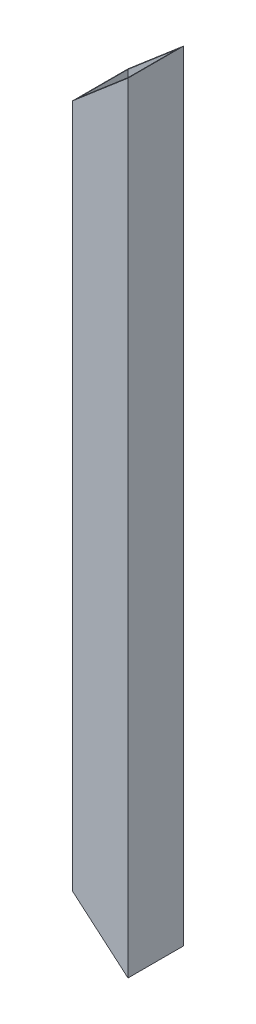
ISO-10303-21;
HEADER;
FILE_DESCRIPTION(('STEP AP214'),'2;1');
FILE_NAME('part.step','',(''),(''),'','','');
FILE_SCHEMA(('AUTOMOTIVE_DESIGN { 1 0 10303 214 1 1 1 1 }'));
ENDSEC;
DATA;
#1=APPLICATION_CONTEXT('core data for automotive mechanical design processes');
#2=APPLICATION_PROTOCOL_DEFINITION('international standard','automotive_design',2000,#1);
#3=PRODUCT_CONTEXT('',#1,'mechanical');
#4=PRODUCT('Part','Part','',(#3));
#5=PRODUCT_RELATED_PRODUCT_CATEGORY('part','',(#4));
#6=PRODUCT_DEFINITION_FORMATION('','',#4);
#7=PRODUCT_DEFINITION_CONTEXT('part definition',#1,'design');
#8=PRODUCT_DEFINITION('design','',#6,#7);
#9=PRODUCT_DEFINITION_SHAPE('','',#8);
#10=(LENGTH_UNIT() NAMED_UNIT(*) SI_UNIT(.MILLI.,.METRE.));
#11=(NAMED_UNIT(*) PLANE_ANGLE_UNIT() SI_UNIT($,.RADIAN.));
#12=(NAMED_UNIT(*) SI_UNIT($,.STERADIAN.) SOLID_ANGLE_UNIT());
#13=UNCERTAINTY_MEASURE_WITH_UNIT(LENGTH_MEASURE(1.E-05),#10,'distance_accuracy_value','');
#14=(GEOMETRIC_REPRESENTATION_CONTEXT(3) GLOBAL_UNCERTAINTY_ASSIGNED_CONTEXT((#13)) GLOBAL_UNIT_ASSIGNED_CONTEXT((#10,
#11,#12)) REPRESENTATION_CONTEXT('',''));
#15=CARTESIAN_POINT('',(0.,0.,0.));
#16=DIRECTION('',(0.,0.,1.));
#17=DIRECTION('',(1.,0.,0.));
#18=AXIS2_PLACEMENT_3D('',#15,#16,#17);
#19=CARTESIAN_POINT('',(-28.575,375.61709738,-28.575));
#20=DIRECTION('',(-0.649871608404462,0.760044007008672,0.));
#21=DIRECTION('',(-0.760044007008672,-0.649871608404462,0.));
#22=AXIS2_PLACEMENT_3D('',#19,#20,#21);
#23=PLANE('',#22);
#24=DIRECTION('',(-0.760044007008672,-0.649871608404462,0.));
#25=VECTOR('',#24,1.);
#26=CARTESIAN_POINT('',(-28.575,375.61709738,0.));
#27=LINE('',#26,#25);
#28=CARTESIAN_POINT('',(0.,400.05,0.));
#29=VERTEX_POINT('',#28);
#30=CARTESIAN_POINT('',(-28.575,375.61709738,0.));
#31=VERTEX_POINT('',#30);
#32=EDGE_CURVE('E118',#29,#31,#27,.T.);
#33=ORIENTED_EDGE('',*,*,#32,.F.);
#34=DIRECTION('',(0.,0.,1.));
#35=VECTOR('',#34,1.);
#36=CARTESIAN_POINT('',(0.,400.05,-28.575));
#37=LINE('',#36,#35);
#38=CARTESIAN_POINT('',(0.,400.05,-28.575));
#39=VERTEX_POINT('',#38);
#40=EDGE_CURVE('E144',#39,#29,#37,.T.);
#41=ORIENTED_EDGE('',*,*,#40,.F.);
#42=DIRECTION('',(-0.760044007008672,-0.649871608404462,0.));
#43=VECTOR('',#42,1.);
#44=CARTESIAN_POINT('',(-28.575,375.61709738,-28.575));
#45=LINE('',#44,#43);
#46=CARTESIAN_POINT('',(-28.575,375.61709738,-28.575));
#47=VERTEX_POINT('',#46);
#48=EDGE_CURVE('E124',#39,#47,#45,.T.);
#49=ORIENTED_EDGE('',*,*,#48,.T.);
#50=DIRECTION('',(0.,0.,1.));
#51=VECTOR('',#50,1.);
#52=CARTESIAN_POINT('',(-28.575,375.61709738,-28.575));
#53=LINE('',#52,#51);
#54=EDGE_CURVE('E127',#47,#31,#53,.T.);
#55=ORIENTED_EDGE('',*,*,#54,.T.);
#56=EDGE_LOOP('',(#33,#41,#49,#55));
#57=FACE_BOUND('',#56,.T.);
#58=DIRECTION('',(0.,0.,1.));
#59=VECTOR('',#58,1.);
#60=CARTESIAN_POINT('',(-1.6002,398.68175745328,-28.575));
#61=LINE('',#60,#59);
#62=CARTESIAN_POINT('',(-1.6002,398.68175745328,-26.9748));
#63=VERTEX_POINT('',#62);
#64=CARTESIAN_POINT('',(-1.6002,398.68175745328,-1.6002));
#65=VERTEX_POINT('',#64);
#66=EDGE_CURVE('E96',#63,#65,#61,.T.);
#67=ORIENTED_EDGE('',*,*,#66,.T.);
#68=DIRECTION('',(-0.760044007008672,-0.649871608404462,0.));
#69=VECTOR('',#68,1.);
#70=CARTESIAN_POINT('',(-197.597105068224,231.095640380549,-1.6002));
#71=LINE('',#70,#69);
#72=CARTESIAN_POINT('',(-26.9748,376.98533992672,-1.6002));
#73=VERTEX_POINT('',#72);
#74=EDGE_CURVE('E84',#65,#73,#71,.T.);
#75=ORIENTED_EDGE('',*,*,#74,.T.);
#76=DIRECTION('',(0.,0.,1.));
#77=VECTOR('',#76,1.);
#78=CARTESIAN_POINT('',(-26.9748,376.98533992672,-28.575));
#79=LINE('',#78,#77);
#80=CARTESIAN_POINT('',(-26.9748,376.98533992672,-26.9748));
#81=VERTEX_POINT('',#80);
#82=EDGE_CURVE('E92',#81,#73,#79,.T.);
#83=ORIENTED_EDGE('',*,*,#82,.F.);
#84=DIRECTION('',(-0.760044007008672,-0.649871608404462,0.));
#85=VECTOR('',#84,1.);
#86=CARTESIAN_POINT('',(-197.597105068224,231.095640380549,-26.9748));
#87=LINE('',#86,#85);
#88=EDGE_CURVE('E30',#63,#81,#87,.T.);
#89=ORIENTED_EDGE('',*,*,#88,.F.);
#90=EDGE_LOOP('',(#67,#75,#83,#89));
#91=FACE_BOUND('',#90,.T.);
#92=ADVANCED_FACE('F15',(#57,#91),#23,.T.);
#93=CARTESIAN_POINT('',(-28.575,24.4329026199999,-28.575));
#94=DIRECTION('',(-0.649871608404461,-0.760044007008672,0.));
#95=DIRECTION('',(0.760044007008673,-0.649871608404461,0.));
#96=AXIS2_PLACEMENT_3D('',#93,#94,#95);
#97=PLANE('',#96);
#98=DIRECTION('',(0.760044007008673,-0.649871608404461,0.));
#99=VECTOR('',#98,1.);
#100=CARTESIAN_POINT('',(-28.575,24.4329026199999,0.));
#101=LINE('',#100,#99);
#102=CARTESIAN_POINT('',(-28.575,24.4329026199999,0.));
#103=VERTEX_POINT('',#102);
#104=CARTESIAN_POINT('',(0.,0.,0.));
#105=VERTEX_POINT('',#104);
#106=EDGE_CURVE('E131',#103,#105,#101,.T.);
#107=ORIENTED_EDGE('',*,*,#106,.F.);
#108=DIRECTION('',(0.,0.,1.));
#109=VECTOR('',#108,1.);
#110=CARTESIAN_POINT('',(-28.575,24.4329026199999,-28.575));
#111=LINE('',#110,#109);
#112=CARTESIAN_POINT('',(-28.575,24.4329026199999,-28.575));
#113=VERTEX_POINT('',#112);
#114=EDGE_CURVE('E9',#113,#103,#111,.T.);
#115=ORIENTED_EDGE('',*,*,#114,.F.);
#116=DIRECTION('',(0.760044007008673,-0.649871608404461,0.));
#117=VECTOR('',#116,1.);
#118=CARTESIAN_POINT('',(-28.575,24.4329026199999,-28.575));
#119=LINE('',#118,#117);
#120=CARTESIAN_POINT('',(0.,0.,-28.575));
#121=VERTEX_POINT('',#120);
#122=EDGE_CURVE('E117',#113,#121,#119,.T.);
#123=ORIENTED_EDGE('',*,*,#122,.T.);
#124=DIRECTION('',(0.,0.,1.));
#125=VECTOR('',#124,1.);
#126=CARTESIAN_POINT('',(0.,0.,-28.575));
#127=LINE('',#126,#125);
#128=EDGE_CURVE('E23',#121,#105,#127,.T.);
#129=ORIENTED_EDGE('',*,*,#128,.T.);
#130=EDGE_LOOP('',(#107,#115,#123,#129));
#131=FACE_BOUND('',#130,.T.);
#132=DIRECTION('',(0.,0.,1.));
#133=VECTOR('',#132,1.);
#134=CARTESIAN_POINT('',(-26.9748,23.0646600732799,-28.575));
#135=LINE('',#134,#133);
#136=CARTESIAN_POINT('',(-26.9748,23.0646600732799,-26.9748));
#137=VERTEX_POINT('',#136);
#138=CARTESIAN_POINT('',(-26.9748,23.0646600732799,-1.6002));
#139=VERTEX_POINT('',#138);
#140=EDGE_CURVE('E108',#137,#139,#135,.T.);
#141=ORIENTED_EDGE('',*,*,#140,.T.);
#142=DIRECTION('',(0.760044007008673,-0.649871608404461,0.));
#143=VECTOR('',#142,1.);
#144=CARTESIAN_POINT('',(0.,0.,-1.6002));
#145=LINE('',#144,#143);
#146=CARTESIAN_POINT('',(-1.6002,1.36824254671999,-1.6002));
#147=VERTEX_POINT('',#146);
#148=EDGE_CURVE('E87',#139,#147,#145,.T.);
#149=ORIENTED_EDGE('',*,*,#148,.T.);
#150=DIRECTION('',(0.,0.,1.));
#151=VECTOR('',#150,1.);
#152=CARTESIAN_POINT('',(-1.6002,1.36824254671999,-28.575));
#153=LINE('',#152,#151);
#154=CARTESIAN_POINT('',(-1.6002,1.36824254671999,-26.9748));
#155=VERTEX_POINT('',#154);
#156=EDGE_CURVE('E106',#155,#147,#153,.T.);
#157=ORIENTED_EDGE('',*,*,#156,.F.);
#158=DIRECTION('',(0.760044007008673,-0.649871608404461,0.));
#159=VECTOR('',#158,1.);
#160=CARTESIAN_POINT('',(0.,0.,-26.9748));
#161=LINE('',#160,#159);
#162=EDGE_CURVE('E101',#137,#155,#161,.T.);
#163=ORIENTED_EDGE('',*,*,#162,.F.);
#164=EDGE_LOOP('',(#141,#149,#157,#163));
#165=FACE_BOUND('',#164,.T.);
#166=ADVANCED_FACE('F148',(#131,#165),#97,.T.);
#167=CARTESIAN_POINT('',(-28.575,200.025,-28.575));
#168=DIRECTION('',(-1.,0.,0.));
#169=DIRECTION('',(0.,-1.,0.));
#170=AXIS2_PLACEMENT_3D('',#167,#168,#169);
#171=PLANE('',#170);
#172=DIRECTION('',(0.,-1.,0.));
#173=VECTOR('',#172,1.);
#174=CARTESIAN_POINT('',(-28.575,200.025,0.));
#175=LINE('',#174,#173);
#176=EDGE_CURVE('E110',#31,#103,#175,.T.);
#177=ORIENTED_EDGE('',*,*,#176,.F.);
#178=ORIENTED_EDGE('',*,*,#54,.F.);
#179=DIRECTION('',(0.,-1.,0.));
#180=VECTOR('',#179,1.);
#181=CARTESIAN_POINT('',(-28.575,200.025,-28.575));
#182=LINE('',#181,#180);
#183=EDGE_CURVE('E114',#47,#113,#182,.T.);
#184=ORIENTED_EDGE('',*,*,#183,.T.);
#185=ORIENTED_EDGE('',*,*,#114,.T.);
#186=EDGE_LOOP('',(#177,#178,#184,#185));
#187=FACE_BOUND('',#186,.T.);
#188=ADVANCED_FACE('F17',(#187),#171,.T.);
#189=CARTESIAN_POINT('',(0.,0.,-28.575));
#190=DIRECTION('',(1.,0.,0.));
#191=DIRECTION('',(0.,1.,0.));
#192=AXIS2_PLACEMENT_3D('',#189,#190,#191);
#193=PLANE('',#192);
#194=DIRECTION('',(0.,1.,0.));
#195=VECTOR('',#194,1.);
#196=CARTESIAN_POINT('',(0.,0.,0.));
#197=LINE('',#196,#195);
#198=EDGE_CURVE('E135',#105,#29,#197,.T.);
#199=ORIENTED_EDGE('',*,*,#198,.F.);
#200=ORIENTED_EDGE('',*,*,#128,.F.);
#201=DIRECTION('',(0.,1.,0.));
#202=VECTOR('',#201,1.);
#203=CARTESIAN_POINT('',(0.,0.,-28.575));
#204=LINE('',#203,#202);
#205=EDGE_CURVE('E121',#121,#39,#204,.T.);
#206=ORIENTED_EDGE('',*,*,#205,.T.);
#207=ORIENTED_EDGE('',*,*,#40,.T.);
#208=EDGE_LOOP('',(#199,#200,#206,#207));
#209=FACE_BOUND('',#208,.T.);
#210=ADVANCED_FACE('F153',(#209),#193,.T.);
#211=CARTESIAN_POINT('',(0.,0.,-28.575));
#212=DIRECTION('',(0.,0.,1.));
#213=DIRECTION('',(1.,0.,0.));
#214=AXIS2_PLACEMENT_3D('',#211,#212,#213);
#215=PLANE('',#214);
#216=ORIENTED_EDGE('',*,*,#183,.F.);
#217=ORIENTED_EDGE('',*,*,#48,.F.);
#218=ORIENTED_EDGE('',*,*,#205,.F.);
#219=ORIENTED_EDGE('',*,*,#122,.F.);
#220=EDGE_LOOP('',(#216,#217,#218,#219));
#221=FACE_BOUND('',#220,.T.);
#222=ADVANCED_FACE('F162',(#221),#215,.F.);
#223=CARTESIAN_POINT('',(0.,0.,0.));
#224=DIRECTION('',(0.,0.,1.));
#225=DIRECTION('',(1.,0.,0.));
#226=AXIS2_PLACEMENT_3D('',#223,#224,#225);
#227=PLANE('',#226);
#228=ORIENTED_EDGE('',*,*,#32,.T.);
#229=ORIENTED_EDGE('',*,*,#176,.T.);
#230=ORIENTED_EDGE('',*,*,#106,.T.);
#231=ORIENTED_EDGE('',*,*,#198,.T.);
#232=EDGE_LOOP('',(#228,#229,#230,#231));
#233=FACE_BOUND('',#232,.T.);
#234=ADVANCED_FACE('F156',(#233),#227,.T.);
#235=CARTESIAN_POINT('',(-26.9748,200.025,-28.575));
#236=DIRECTION('',(-1.,0.,0.));
#237=DIRECTION('',(0.,-1.,0.));
#238=AXIS2_PLACEMENT_3D('',#235,#236,#237);
#239=PLANE('',#238);
#240=DIRECTION('',(0.,-1.,0.));
#241=VECTOR('',#240,1.);
#242=CARTESIAN_POINT('',(-26.9748,0.,-1.6002));
#243=LINE('',#242,#241);
#244=EDGE_CURVE('E79',#73,#139,#243,.T.);
#245=ORIENTED_EDGE('',*,*,#244,.T.);
#246=ORIENTED_EDGE('',*,*,#140,.F.);
#247=DIRECTION('',(0.,-1.,0.));
#248=VECTOR('',#247,1.);
#249=CARTESIAN_POINT('',(-26.9748,0.,-26.9748));
#250=LINE('',#249,#248);
#251=EDGE_CURVE('E94',#81,#137,#250,.T.);
#252=ORIENTED_EDGE('',*,*,#251,.F.);
#253=ORIENTED_EDGE('',*,*,#82,.T.);
#254=EDGE_LOOP('',(#245,#246,#252,#253));
#255=FACE_BOUND('',#254,.T.);
#256=ADVANCED_FACE('F93',(#255),#239,.F.);
#257=CARTESIAN_POINT('',(-1.6002,0.,-28.575));
#258=DIRECTION('',(1.,0.,0.));
#259=DIRECTION('',(0.,1.,0.));
#260=AXIS2_PLACEMENT_3D('',#257,#258,#259);
#261=PLANE('',#260);
#262=DIRECTION('',(0.,1.,0.));
#263=VECTOR('',#262,1.);
#264=CARTESIAN_POINT('',(-1.6002,0.,-1.6002));
#265=LINE('',#264,#263);
#266=EDGE_CURVE('E99',#147,#65,#265,.T.);
#267=ORIENTED_EDGE('',*,*,#266,.T.);
#268=ORIENTED_EDGE('',*,*,#66,.F.);
#269=DIRECTION('',(0.,1.,0.));
#270=VECTOR('',#269,1.);
#271=CARTESIAN_POINT('',(-1.6002,0.,-26.9748));
#272=LINE('',#271,#270);
#273=EDGE_CURVE('E37',#155,#63,#272,.T.);
#274=ORIENTED_EDGE('',*,*,#273,.F.);
#275=ORIENTED_EDGE('',*,*,#156,.T.);
#276=EDGE_LOOP('',(#267,#268,#274,#275));
#277=FACE_BOUND('',#276,.T.);
#278=ADVANCED_FACE('F215',(#277),#261,.F.);
#279=CARTESIAN_POINT('',(0.,0.,-26.9748));
#280=DIRECTION('',(0.,0.,1.));
#281=DIRECTION('',(1.,0.,0.));
#282=AXIS2_PLACEMENT_3D('',#279,#280,#281);
#283=PLANE('',#282);
#284=ORIENTED_EDGE('',*,*,#251,.T.);
#285=ORIENTED_EDGE('',*,*,#162,.T.);
#286=ORIENTED_EDGE('',*,*,#273,.T.);
#287=ORIENTED_EDGE('',*,*,#88,.T.);
#288=EDGE_LOOP('',(#284,#285,#286,#287));
#289=FACE_BOUND('',#288,.T.);
#290=ADVANCED_FACE('F225',(#289),#283,.T.);
#291=CARTESIAN_POINT('',(0.,0.,-1.6002));
#292=DIRECTION('',(0.,0.,1.));
#293=DIRECTION('',(1.,0.,0.));
#294=AXIS2_PLACEMENT_3D('',#291,#292,#293);
#295=PLANE('',#294);
#296=ORIENTED_EDGE('',*,*,#74,.F.);
#297=ORIENTED_EDGE('',*,*,#266,.F.);
#298=ORIENTED_EDGE('',*,*,#148,.F.);
#299=ORIENTED_EDGE('',*,*,#244,.F.);
#300=EDGE_LOOP('',(#296,#297,#298,#299));
#301=FACE_BOUND('',#300,.T.);
#302=ADVANCED_FACE('F81',(#301),#295,.F.);
#303=CLOSED_SHELL('',(#92,#166,#188,#210,#222,#234,#256,#278,#290,#302));
#304=MANIFOLD_SOLID_BREP('B1',#303);
#305=ADVANCED_BREP_SHAPE_REPRESENTATION('',(#18,#304),#14);
#306=SHAPE_DEFINITION_REPRESENTATION(#9,#305);
ENDSEC;
END-ISO-10303-21;
